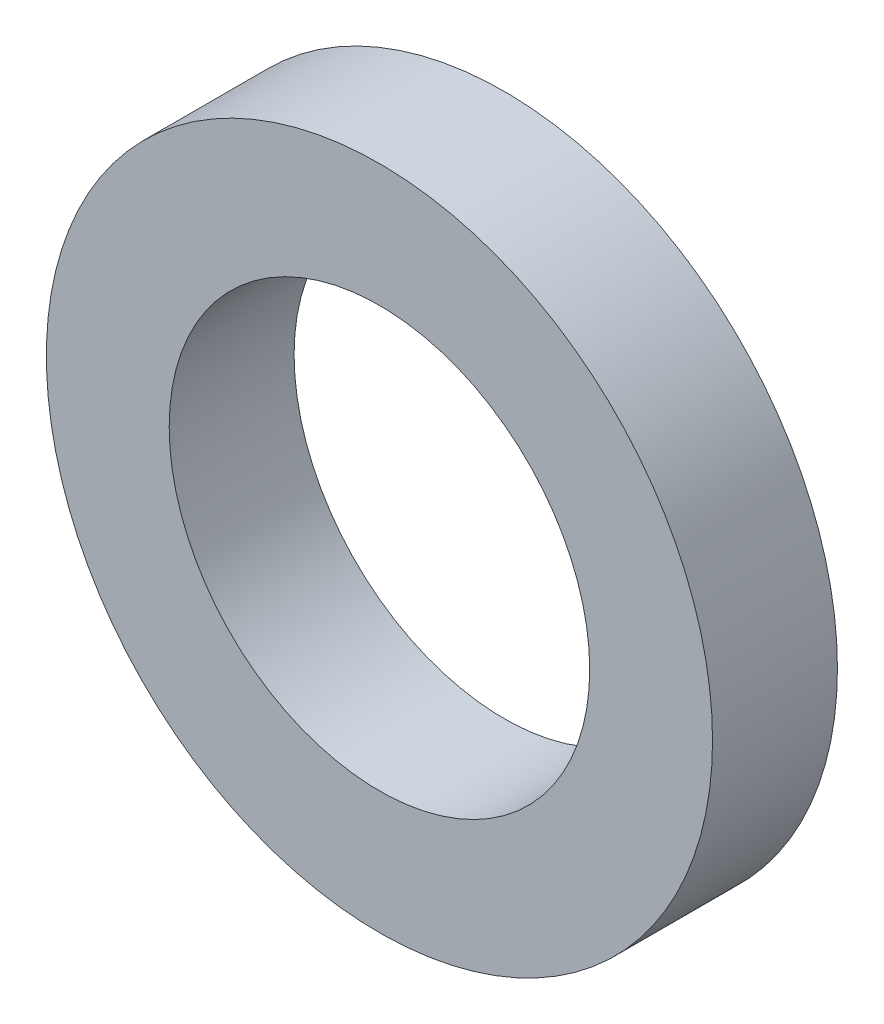
ISO-10303-21;
HEADER;
FILE_DESCRIPTION(('STEP AP214'),'2;1');
FILE_NAME('part.step','',(''),(''),'','','');
FILE_SCHEMA(('AUTOMOTIVE_DESIGN { 1 0 10303 214 1 1 1 1 }'));
ENDSEC;
DATA;
#1=APPLICATION_CONTEXT('core data for automotive mechanical design processes');
#2=APPLICATION_PROTOCOL_DEFINITION('international standard','automotive_design',2000,#1);
#3=PRODUCT_CONTEXT('',#1,'mechanical');
#4=PRODUCT('Part','Part','',(#3));
#5=PRODUCT_RELATED_PRODUCT_CATEGORY('part','',(#4));
#6=PRODUCT_DEFINITION_FORMATION('','',#4);
#7=PRODUCT_DEFINITION_CONTEXT('part definition',#1,'design');
#8=PRODUCT_DEFINITION('design','',#6,#7);
#9=PRODUCT_DEFINITION_SHAPE('','',#8);
#10=(LENGTH_UNIT() NAMED_UNIT(*) SI_UNIT(.MILLI.,.METRE.));
#11=(NAMED_UNIT(*) PLANE_ANGLE_UNIT() SI_UNIT($,.RADIAN.));
#12=(NAMED_UNIT(*) SI_UNIT($,.STERADIAN.) SOLID_ANGLE_UNIT());
#13=UNCERTAINTY_MEASURE_WITH_UNIT(LENGTH_MEASURE(1.E-05),#10,'distance_accuracy_value','');
#14=(GEOMETRIC_REPRESENTATION_CONTEXT(3) GLOBAL_UNCERTAINTY_ASSIGNED_CONTEXT((#13)) GLOBAL_UNIT_ASSIGNED_CONTEXT((#10,
#11,#12)) REPRESENTATION_CONTEXT('',''));
#15=CARTESIAN_POINT('',(0.,0.,0.));
#16=DIRECTION('',(0.,0.,1.));
#17=DIRECTION('',(1.,0.,0.));
#18=AXIS2_PLACEMENT_3D('',#15,#16,#17);
#19=CARTESIAN_POINT('',(0.,0.,3.));
#20=DIRECTION('',(0.,0.,1.));
#21=DIRECTION('',(1.,0.,0.));
#22=AXIS2_PLACEMENT_3D('',#19,#20,#21);
#23=PLANE('',#22);
#24=CARTESIAN_POINT('',(0.,0.,3.));
#25=DIRECTION('',(0.,0.,1.));
#26=DIRECTION('',(1.,0.,0.));
#27=AXIS2_PLACEMENT_3D('',#24,#25,#26);
#28=CIRCLE('',#27,16.);
#29=CARTESIAN_POINT('',(16.,0.,3.));
#30=VERTEX_POINT('',#29);
#31=EDGE_CURVE('E10',#30,#30,#28,.T.);
#32=ORIENTED_EDGE('',*,*,#31,.T.);
#33=EDGE_LOOP('',(#32));
#34=FACE_BOUND('',#33,.T.);
#35=CARTESIAN_POINT('',(0.,0.,3.));
#36=DIRECTION('',(0.,0.,1.));
#37=DIRECTION('',(1.,0.,0.));
#38=AXIS2_PLACEMENT_3D('',#35,#36,#37);
#39=CIRCLE('',#38,10.1);
#40=CARTESIAN_POINT('',(10.1,0.,3.));
#41=VERTEX_POINT('',#40);
#42=EDGE_CURVE('E42',#41,#41,#39,.T.);
#43=ORIENTED_EDGE('',*,*,#42,.F.);
#44=EDGE_LOOP('',(#43));
#45=FACE_BOUND('',#44,.T.);
#46=ADVANCED_FACE('F31',(#34,#45),#23,.T.);
#47=CARTESIAN_POINT('',(0.,0.,-3.));
#48=DIRECTION('',(0.,0.,1.));
#49=DIRECTION('',(1.,0.,0.));
#50=AXIS2_PLACEMENT_3D('',#47,#48,#49);
#51=PLANE('',#50);
#52=CARTESIAN_POINT('',(0.,0.,-3.));
#53=DIRECTION('',(0.,0.,1.));
#54=DIRECTION('',(1.,0.,0.));
#55=AXIS2_PLACEMENT_3D('',#52,#53,#54);
#56=CIRCLE('',#55,16.);
#57=CARTESIAN_POINT('',(16.,0.,-3.));
#58=VERTEX_POINT('',#57);
#59=EDGE_CURVE('E35',#58,#58,#56,.T.);
#60=ORIENTED_EDGE('',*,*,#59,.F.);
#61=EDGE_LOOP('',(#60));
#62=FACE_BOUND('',#61,.T.);
#63=CARTESIAN_POINT('',(0.,0.,-3.));
#64=DIRECTION('',(0.,0.,1.));
#65=DIRECTION('',(1.,0.,0.));
#66=AXIS2_PLACEMENT_3D('',#63,#64,#65);
#67=CIRCLE('',#66,10.1);
#68=CARTESIAN_POINT('',(10.1,0.,-3.));
#69=VERTEX_POINT('',#68);
#70=EDGE_CURVE('E44',#69,#69,#67,.T.);
#71=ORIENTED_EDGE('',*,*,#70,.T.);
#72=EDGE_LOOP('',(#71));
#73=FACE_BOUND('',#72,.T.);
#74=ADVANCED_FACE('F54',(#62,#73),#51,.F.);
#75=CARTESIAN_POINT('',(0.,0.,3.));
#76=DIRECTION('',(0.,0.,-1.));
#77=DIRECTION('',(-1.,0.,0.));
#78=AXIS2_PLACEMENT_3D('',#75,#76,#77);
#79=CYLINDRICAL_SURFACE('',#78,16.);
#80=ORIENTED_EDGE('',*,*,#31,.F.);
#81=EDGE_LOOP('',(#80));
#82=FACE_BOUND('',#81,.T.);
#83=ORIENTED_EDGE('',*,*,#59,.T.);
#84=EDGE_LOOP('',(#83));
#85=FACE_BOUND('',#84,.T.);
#86=ADVANCED_FACE('F33',(#82,#85),#79,.T.);
#87=CARTESIAN_POINT('',(0.,0.,3.));
#88=DIRECTION('',(0.,0.,-1.));
#89=DIRECTION('',(-1.,0.,0.));
#90=AXIS2_PLACEMENT_3D('',#87,#88,#89);
#91=CYLINDRICAL_SURFACE('',#90,10.1);
#92=ORIENTED_EDGE('',*,*,#42,.T.);
#93=EDGE_LOOP('',(#92));
#94=FACE_BOUND('',#93,.T.);
#95=ORIENTED_EDGE('',*,*,#70,.F.);
#96=EDGE_LOOP('',(#95));
#97=FACE_BOUND('',#96,.T.);
#98=ADVANCED_FACE('F50',(#94,#97),#91,.F.);
#99=CLOSED_SHELL('',(#46,#74,#86,#98));
#100=MANIFOLD_SOLID_BREP('B2',#99);
#101=ADVANCED_BREP_SHAPE_REPRESENTATION('',(#18,#100),#14);
#102=SHAPE_DEFINITION_REPRESENTATION(#9,#101);
ENDSEC;
END-ISO-10303-21;
